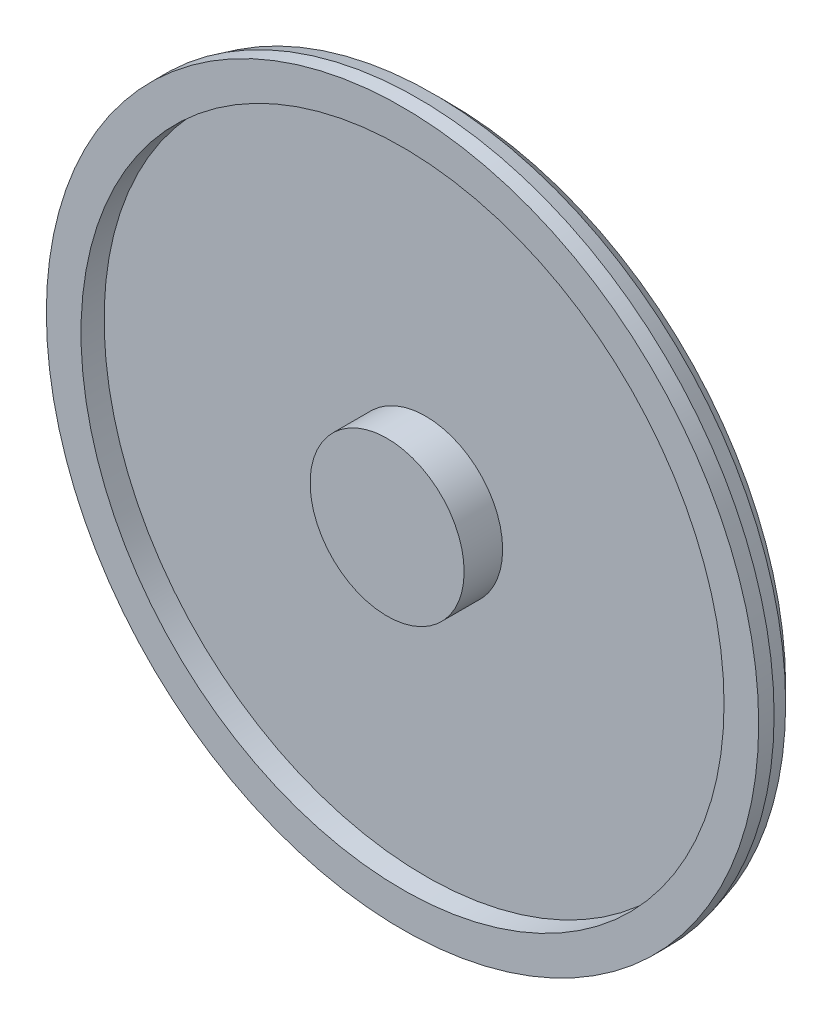
ISO-10303-21;
HEADER;
FILE_DESCRIPTION(('STEP AP214'),'2;1');
FILE_NAME('part.step','',(''),(''),'','','');
FILE_SCHEMA(('AUTOMOTIVE_DESIGN { 1 0 10303 214 1 1 1 1 }'));
ENDSEC;
DATA;
#1=APPLICATION_CONTEXT('core data for automotive mechanical design processes');
#2=APPLICATION_PROTOCOL_DEFINITION('international standard','automotive_design',2000,#1);
#3=PRODUCT_CONTEXT('',#1,'mechanical');
#4=PRODUCT('Part','Part','',(#3));
#5=PRODUCT_RELATED_PRODUCT_CATEGORY('part','',(#4));
#6=PRODUCT_DEFINITION_FORMATION('','',#4);
#7=PRODUCT_DEFINITION_CONTEXT('part definition',#1,'design');
#8=PRODUCT_DEFINITION('design','',#6,#7);
#9=PRODUCT_DEFINITION_SHAPE('','',#8);
#10=(LENGTH_UNIT() NAMED_UNIT(*) SI_UNIT(.MILLI.,.METRE.));
#11=(NAMED_UNIT(*) PLANE_ANGLE_UNIT() SI_UNIT($,.RADIAN.));
#12=(NAMED_UNIT(*) SI_UNIT($,.STERADIAN.) SOLID_ANGLE_UNIT());
#13=UNCERTAINTY_MEASURE_WITH_UNIT(LENGTH_MEASURE(1.E-05),#10,'distance_accuracy_value','');
#14=(GEOMETRIC_REPRESENTATION_CONTEXT(3) GLOBAL_UNCERTAINTY_ASSIGNED_CONTEXT((#13)) GLOBAL_UNIT_ASSIGNED_CONTEXT((#10,
#11,#12)) REPRESENTATION_CONTEXT('',''));
#15=CARTESIAN_POINT('',(0.,0.,0.));
#16=DIRECTION('',(0.,0.,1.));
#17=DIRECTION('',(1.,0.,0.));
#18=AXIS2_PLACEMENT_3D('',#15,#16,#17);
#19=CARTESIAN_POINT('',(0.,0.,404.979253112033));
#20=DIRECTION('',(0.,0.,1.));
#21=DIRECTION('',(1.,0.,0.));
#22=AXIS2_PLACEMENT_3D('',#19,#20,#21);
#23=CYLINDRICAL_SURFACE('',#22,417.5);
#24=CARTESIAN_POINT('',(0.,0.,-50.));
#25=DIRECTION('',(0.,0.,1.));
#26=DIRECTION('',(1.,0.,0.));
#27=AXIS2_PLACEMENT_3D('',#24,#25,#26);
#28=CIRCLE('',#27,417.5);
#29=CARTESIAN_POINT('',(417.5,0.,-50.));
#30=VERTEX_POINT('',#29);
#31=EDGE_CURVE('E63',#30,#30,#28,.T.);
#32=ORIENTED_EDGE('',*,*,#31,.F.);
#33=EDGE_LOOP('',(#32));
#34=FACE_BOUND('',#33,.T.);
#35=CARTESIAN_POINT('',(0.,0.,-20.));
#36=DIRECTION('',(0.,0.,1.));
#37=DIRECTION('',(1.,0.,0.));
#38=AXIS2_PLACEMENT_3D('',#35,#36,#37);
#39=CIRCLE('',#38,417.5);
#40=CARTESIAN_POINT('',(417.5,0.,-20.));
#41=VERTEX_POINT('',#40);
#42=EDGE_CURVE('E10',#41,#41,#39,.T.);
#43=ORIENTED_EDGE('',*,*,#42,.T.);
#44=EDGE_LOOP('',(#43));
#45=FACE_BOUND('',#44,.T.);
#46=ADVANCED_FACE('F35',(#34,#45),#23,.F.);
#47=CARTESIAN_POINT('',(0.,417.5,-19.9999999999999));
#48=DIRECTION('',(0.,0.,-1.));
#49=DIRECTION('',(-1.,0.,0.));
#50=AXIS2_PLACEMENT_3D('',#47,#48,#49);
#51=PLANE('',#50);
#52=ORIENTED_EDGE('',*,*,#42,.F.);
#53=EDGE_LOOP('',(#52));
#54=FACE_BOUND('',#53,.T.);
#55=CARTESIAN_POINT('',(0.,0.,-20.));
#56=DIRECTION('',(0.,0.,1.));
#57=DIRECTION('',(1.,0.,0.));
#58=AXIS2_PLACEMENT_3D('',#55,#56,#57);
#59=CIRCLE('',#58,462.5);
#60=CARTESIAN_POINT('',(462.5,0.,-20.));
#61=VERTEX_POINT('',#60);
#62=EDGE_CURVE('E41',#61,#61,#59,.T.);
#63=ORIENTED_EDGE('',*,*,#62,.T.);
#64=EDGE_LOOP('',(#63));
#65=FACE_BOUND('',#64,.T.);
#66=ADVANCED_FACE('F70',(#54,#65),#51,.F.);
#67=CARTESIAN_POINT('',(0.,0.,404.979253112033));
#68=DIRECTION('',(0.,0.,1.));
#69=DIRECTION('',(1.,0.,0.));
#70=AXIS2_PLACEMENT_3D('',#67,#68,#69);
#71=CYLINDRICAL_SURFACE('',#70,462.5);
#72=ORIENTED_EDGE('',*,*,#62,.F.);
#73=EDGE_LOOP('',(#72));
#74=FACE_BOUND('',#73,.T.);
#75=CARTESIAN_POINT('',(0.,0.,-39.9999999999999));
#76=DIRECTION('',(0.,0.,1.));
#77=DIRECTION('',(1.,0.,0.));
#78=AXIS2_PLACEMENT_3D('',#75,#76,#77);
#79=CIRCLE('',#78,462.5);
#80=CARTESIAN_POINT('',(462.5,0.,-39.9999999999999));
#81=VERTEX_POINT('',#80);
#82=EDGE_CURVE('E45',#81,#81,#79,.T.);
#83=ORIENTED_EDGE('',*,*,#82,.T.);
#84=EDGE_LOOP('',(#83));
#85=FACE_BOUND('',#84,.T.);
#86=ADVANCED_FACE('F74',(#74,#85),#71,.T.);
#87=CARTESIAN_POINT('',(0.,0.,-60.4903810567665));
#88=DIRECTION('',(0.,0.,1.));
#89=DIRECTION('',(1.,0.,0.));
#90=AXIS2_PLACEMENT_3D('',#87,#88,#89);
#91=CONICAL_SURFACE('',#90,457.009618943233,0.26179938779915);
#92=ORIENTED_EDGE('',*,*,#82,.F.);
#93=EDGE_LOOP('',(#92));
#94=FACE_BOUND('',#93,.T.);
#95=CARTESIAN_POINT('',(0.,0.,-60.4903810567665));
#96=DIRECTION('',(0.,0.,1.));
#97=DIRECTION('',(1.,0.,0.));
#98=AXIS2_PLACEMENT_3D('',#95,#96,#97);
#99=CIRCLE('',#98,457.009618943233);
#100=CARTESIAN_POINT('',(457.009618943233,0.,-60.4903810567665));
#101=VERTEX_POINT('',#100);
#102=EDGE_CURVE('E49',#101,#101,#99,.T.);
#103=ORIENTED_EDGE('',*,*,#102,.T.);
#104=EDGE_LOOP('',(#103));
#105=FACE_BOUND('',#104,.T.);
#106=ADVANCED_FACE('F79',(#94,#105),#91,.T.);
#107=CARTESIAN_POINT('',(0.,0.,-80.));
#108=DIRECTION('',(0.,0.,1.));
#109=DIRECTION('',(1.,0.,0.));
#110=AXIS2_PLACEMENT_3D('',#107,#108,#109);
#111=CONICAL_SURFACE('',#110,437.5,0.785398163397447);
#112=ORIENTED_EDGE('',*,*,#102,.F.);
#113=EDGE_LOOP('',(#112));
#114=FACE_BOUND('',#113,.T.);
#115=CARTESIAN_POINT('',(0.,0.,-80.));
#116=DIRECTION('',(0.,0.,1.));
#117=DIRECTION('',(1.,0.,0.));
#118=AXIS2_PLACEMENT_3D('',#115,#116,#117);
#119=CIRCLE('',#118,437.5);
#120=CARTESIAN_POINT('',(437.5,0.,-80.));
#121=VERTEX_POINT('',#120);
#122=EDGE_CURVE('E54',#121,#121,#119,.T.);
#123=ORIENTED_EDGE('',*,*,#122,.T.);
#124=EDGE_LOOP('',(#123));
#125=FACE_BOUND('',#124,.T.);
#126=ADVANCED_FACE('F85',(#114,#125),#111,.T.);
#127=CARTESIAN_POINT('',(0.,437.5,-80.));
#128=DIRECTION('',(0.,0.,1.));
#129=DIRECTION('',(1.,0.,0.));
#130=AXIS2_PLACEMENT_3D('',#127,#128,#129);
#131=PLANE('',#130);
#132=ORIENTED_EDGE('',*,*,#122,.F.);
#133=EDGE_LOOP('',(#132));
#134=FACE_BOUND('',#133,.T.);
#135=ADVANCED_FACE('F89',(#134),#131,.F.);
#136=CARTESIAN_POINT('',(0.,0.,0.));
#137=DIRECTION('',(0.,0.,-1.));
#138=DIRECTION('',(-1.,0.,0.));
#139=AXIS2_PLACEMENT_3D('',#136,#137,#138);
#140=PLANE('',#139);
#141=CARTESIAN_POINT('',(0.,0.,0.));
#142=DIRECTION('',(0.,0.,1.));
#143=DIRECTION('',(1.,0.,0.));
#144=AXIS2_PLACEMENT_3D('',#141,#142,#143);
#145=CIRCLE('',#144,100.);
#146=CARTESIAN_POINT('',(100.,0.,0.));
#147=VERTEX_POINT('',#146);
#148=EDGE_CURVE('E57',#147,#147,#145,.T.);
#149=ORIENTED_EDGE('',*,*,#148,.T.);
#150=EDGE_LOOP('',(#149));
#151=FACE_BOUND('',#150,.T.);
#152=ADVANCED_FACE('F93',(#151),#140,.F.);
#153=CARTESIAN_POINT('',(0.,0.,404.979253112033));
#154=DIRECTION('',(0.,0.,1.));
#155=DIRECTION('',(1.,0.,0.));
#156=AXIS2_PLACEMENT_3D('',#153,#154,#155);
#157=CYLINDRICAL_SURFACE('',#156,100.);
#158=ORIENTED_EDGE('',*,*,#148,.F.);
#159=EDGE_LOOP('',(#158));
#160=FACE_BOUND('',#159,.T.);
#161=CARTESIAN_POINT('',(0.,0.,-50.));
#162=DIRECTION('',(0.,0.,1.));
#163=DIRECTION('',(1.,0.,0.));
#164=AXIS2_PLACEMENT_3D('',#161,#162,#163);
#165=CIRCLE('',#164,100.);
#166=CARTESIAN_POINT('',(100.,0.,-50.));
#167=VERTEX_POINT('',#166);
#168=EDGE_CURVE('E60',#167,#167,#165,.T.);
#169=ORIENTED_EDGE('',*,*,#168,.T.);
#170=EDGE_LOOP('',(#169));
#171=FACE_BOUND('',#170,.T.);
#172=ADVANCED_FACE('F97',(#160,#171),#157,.T.);
#173=CARTESIAN_POINT('',(0.,100.,-50.));
#174=DIRECTION('',(0.,0.,-1.));
#175=DIRECTION('',(-1.,0.,0.));
#176=AXIS2_PLACEMENT_3D('',#173,#174,#175);
#177=PLANE('',#176);
#178=ORIENTED_EDGE('',*,*,#168,.F.);
#179=EDGE_LOOP('',(#178));
#180=FACE_BOUND('',#179,.T.);
#181=ORIENTED_EDGE('',*,*,#31,.T.);
#182=EDGE_LOOP('',(#181));
#183=FACE_BOUND('',#182,.T.);
#184=ADVANCED_FACE('F67',(#180,#183),#177,.F.);
#185=CLOSED_SHELL('',(#46,#66,#86,#106,#126,#135,#152,#172,#184));
#186=MANIFOLD_SOLID_BREP('B2',#185);
#187=ADVANCED_BREP_SHAPE_REPRESENTATION('',(#18,#186),#14);
#188=SHAPE_DEFINITION_REPRESENTATION(#9,#187);
ENDSEC;
END-ISO-10303-21;
